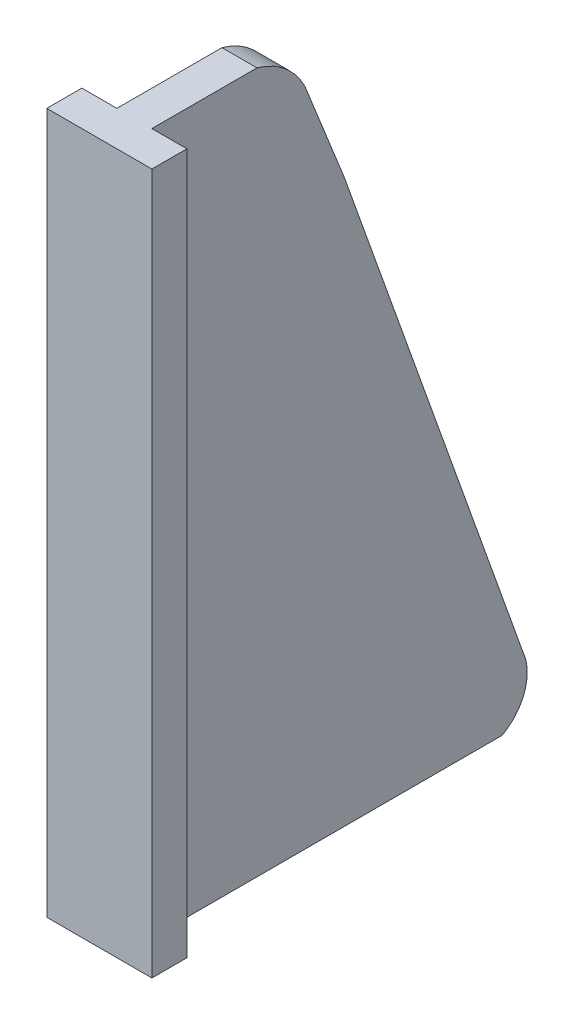
ISO-10303-21;
HEADER;
FILE_DESCRIPTION(('STEP AP214'),'2;1');
FILE_NAME('part.step','',(''),(''),'','','');
FILE_SCHEMA(('AUTOMOTIVE_DESIGN { 1 0 10303 214 1 1 1 1 }'));
ENDSEC;
DATA;
#1=APPLICATION_CONTEXT('core data for automotive mechanical design processes');
#2=APPLICATION_PROTOCOL_DEFINITION('international standard','automotive_design',2000,#1);
#3=PRODUCT_CONTEXT('',#1,'mechanical');
#4=PRODUCT('Part','Part','',(#3));
#5=PRODUCT_RELATED_PRODUCT_CATEGORY('part','',(#4));
#6=PRODUCT_DEFINITION_FORMATION('','',#4);
#7=PRODUCT_DEFINITION_CONTEXT('part definition',#1,'design');
#8=PRODUCT_DEFINITION('design','',#6,#7);
#9=PRODUCT_DEFINITION_SHAPE('','',#8);
#10=(LENGTH_UNIT() NAMED_UNIT(*) SI_UNIT(.MILLI.,.METRE.));
#11=(NAMED_UNIT(*) PLANE_ANGLE_UNIT() SI_UNIT($,.RADIAN.));
#12=(NAMED_UNIT(*) SI_UNIT($,.STERADIAN.) SOLID_ANGLE_UNIT());
#13=UNCERTAINTY_MEASURE_WITH_UNIT(LENGTH_MEASURE(1.E-05),#10,'distance_accuracy_value','');
#14=(GEOMETRIC_REPRESENTATION_CONTEXT(3) GLOBAL_UNCERTAINTY_ASSIGNED_CONTEXT((#13)) GLOBAL_UNIT_ASSIGNED_CONTEXT((#10,
#11,#12)) REPRESENTATION_CONTEXT('',''));
#15=CARTESIAN_POINT('',(0.,0.,0.));
#16=DIRECTION('',(0.,0.,1.));
#17=DIRECTION('',(1.,0.,0.));
#18=AXIS2_PLACEMENT_3D('',#15,#16,#17);
#19=CARTESIAN_POINT('',(30.,0.,0.));
#20=DIRECTION('',(0.,1.,0.));
#21=DIRECTION('',(0.,0.,1.));
#22=AXIS2_PLACEMENT_3D('',#19,#20,#21);
#23=PLANE('',#22);
#24=DIRECTION('',(-1.,0.,0.));
#25=VECTOR('',#24,1.);
#26=CARTESIAN_POINT('',(30.,0.,-10.));
#27=LINE('',#26,#25);
#28=CARTESIAN_POINT('',(10.,0.,-10.));
#29=VERTEX_POINT('',#28);
#30=CARTESIAN_POINT('',(0.,0.,-9.99999999999999));
#31=VERTEX_POINT('',#30);
#32=EDGE_CURVE('E47',#29,#31,#27,.T.);
#33=ORIENTED_EDGE('',*,*,#32,.F.);
#34=DIRECTION('',(0.,0.,-1.));
#35=VECTOR('',#34,1.);
#36=CARTESIAN_POINT('',(10.,0.,0.));
#37=LINE('',#36,#35);
#38=CARTESIAN_POINT('',(10.,0.,-110.));
#39=VERTEX_POINT('',#38);
#40=EDGE_CURVE('E117',#29,#39,#37,.T.);
#41=ORIENTED_EDGE('',*,*,#40,.T.);
#42=DIRECTION('',(-1.,0.,0.));
#43=VECTOR('',#42,1.);
#44=CARTESIAN_POINT('',(30.,0.,-110.));
#45=LINE('',#44,#43);
#46=CARTESIAN_POINT('',(20.,0.,-110.));
#47=VERTEX_POINT('',#46);
#48=EDGE_CURVE('E197',#47,#39,#45,.T.);
#49=ORIENTED_EDGE('',*,*,#48,.F.);
#50=DIRECTION('',(0.,0.,1.));
#51=VECTOR('',#50,1.);
#52=CARTESIAN_POINT('',(20.,0.,0.));
#53=LINE('',#52,#51);
#54=CARTESIAN_POINT('',(20.,0.,-10.));
#55=VERTEX_POINT('',#54);
#56=EDGE_CURVE('E165',#47,#55,#53,.T.);
#57=ORIENTED_EDGE('',*,*,#56,.T.);
#58=DIRECTION('',(-1.,0.,0.));
#59=VECTOR('',#58,1.);
#60=CARTESIAN_POINT('',(30.,0.,-10.));
#61=LINE('',#60,#59);
#62=CARTESIAN_POINT('',(30.,0.,-9.99999999999999));
#63=VERTEX_POINT('',#62);
#64=EDGE_CURVE('E151',#63,#55,#61,.T.);
#65=ORIENTED_EDGE('',*,*,#64,.F.);
#66=DIRECTION('',(0.,0.,-1.));
#67=VECTOR('',#66,1.);
#68=CARTESIAN_POINT('',(30.,0.,0.));
#69=LINE('',#68,#67);
#70=CARTESIAN_POINT('',(30.,0.,0.));
#71=VERTEX_POINT('',#70);
#72=EDGE_CURVE('E168',#71,#63,#69,.T.);
#73=ORIENTED_EDGE('',*,*,#72,.F.);
#74=DIRECTION('',(-1.,0.,0.));
#75=VECTOR('',#74,1.);
#76=CARTESIAN_POINT('',(30.,0.,0.));
#77=LINE('',#76,#75);
#78=CARTESIAN_POINT('',(0.,0.,0.));
#79=VERTEX_POINT('',#78);
#80=EDGE_CURVE('E176',#71,#79,#77,.T.);
#81=ORIENTED_EDGE('',*,*,#80,.T.);
#82=DIRECTION('',(0.,0.,-1.));
#83=VECTOR('',#82,1.);
#84=CARTESIAN_POINT('',(0.,0.,0.));
#85=LINE('',#84,#83);
#86=EDGE_CURVE('E136',#79,#31,#85,.T.);
#87=ORIENTED_EDGE('',*,*,#86,.T.);
#88=EDGE_LOOP('',(#33,#41,#49,#57,#65,#73,#81,#87));
#89=FACE_BOUND('',#88,.T.);
#90=ADVANCED_FACE('F33',(#89),#23,.F.);
#91=CARTESIAN_POINT('',(30.,200.,0.));
#92=DIRECTION('',(0.,-1.,0.));
#93=DIRECTION('',(0.,0.,-1.));
#94=AXIS2_PLACEMENT_3D('',#91,#92,#93);
#95=PLANE('',#94);
#96=DIRECTION('',(1.,0.,0.));
#97=VECTOR('',#96,1.);
#98=CARTESIAN_POINT('',(30.,200.,-9.99999999999999));
#99=LINE('',#98,#97);
#100=CARTESIAN_POINT('',(0.,200.,-9.99999999999999));
#101=VERTEX_POINT('',#100);
#102=CARTESIAN_POINT('',(10.,200.,-9.99999999999999));
#103=VERTEX_POINT('',#102);
#104=EDGE_CURVE('E131',#101,#103,#99,.T.);
#105=ORIENTED_EDGE('',*,*,#104,.F.);
#106=DIRECTION('',(0.,0.,1.));
#107=VECTOR('',#106,1.);
#108=CARTESIAN_POINT('',(0.,200.,0.));
#109=LINE('',#108,#107);
#110=CARTESIAN_POINT('',(0.,200.,0.));
#111=VERTEX_POINT('',#110);
#112=EDGE_CURVE('E178',#101,#111,#109,.T.);
#113=ORIENTED_EDGE('',*,*,#112,.T.);
#114=DIRECTION('',(-1.,0.,0.));
#115=VECTOR('',#114,1.);
#116=CARTESIAN_POINT('',(30.,200.,0.));
#117=LINE('',#116,#115);
#118=CARTESIAN_POINT('',(30.,200.,0.));
#119=VERTEX_POINT('',#118);
#120=EDGE_CURVE('E182',#119,#111,#117,.T.);
#121=ORIENTED_EDGE('',*,*,#120,.F.);
#122=DIRECTION('',(0.,0.,1.));
#123=VECTOR('',#122,1.);
#124=CARTESIAN_POINT('',(30.,200.,0.));
#125=LINE('',#124,#123);
#126=CARTESIAN_POINT('',(30.,200.,-9.99999999999999));
#127=VERTEX_POINT('',#126);
#128=EDGE_CURVE('E171',#127,#119,#125,.T.);
#129=ORIENTED_EDGE('',*,*,#128,.F.);
#130=DIRECTION('',(1.,0.,0.));
#131=VECTOR('',#130,1.);
#132=CARTESIAN_POINT('',(30.,200.,-10.));
#133=LINE('',#132,#131);
#134=CARTESIAN_POINT('',(20.,200.,-10.));
#135=VERTEX_POINT('',#134);
#136=EDGE_CURVE('E55',#135,#127,#133,.T.);
#137=ORIENTED_EDGE('',*,*,#136,.F.);
#138=DIRECTION('',(0.,0.,-1.));
#139=VECTOR('',#138,1.);
#140=CARTESIAN_POINT('',(20.,200.,0.));
#141=LINE('',#140,#139);
#142=CARTESIAN_POINT('',(20.,200.,-40.0204083587879));
#143=VERTEX_POINT('',#142);
#144=EDGE_CURVE('E201',#135,#143,#141,.T.);
#145=ORIENTED_EDGE('',*,*,#144,.T.);
#146=DIRECTION('',(-1.,0.,0.));
#147=VECTOR('',#146,1.);
#148=CARTESIAN_POINT('',(30.,200.,-40.0204083587879));
#149=LINE('',#148,#147);
#150=CARTESIAN_POINT('',(10.,200.,-40.0204083587879));
#151=VERTEX_POINT('',#150);
#152=EDGE_CURVE('E185',#143,#151,#149,.T.);
#153=ORIENTED_EDGE('',*,*,#152,.T.);
#154=DIRECTION('',(0.,0.,1.));
#155=VECTOR('',#154,1.);
#156=CARTESIAN_POINT('',(10.,200.,0.));
#157=LINE('',#156,#155);
#158=EDGE_CURVE('E127',#151,#103,#157,.T.);
#159=ORIENTED_EDGE('',*,*,#158,.T.);
#160=EDGE_LOOP('',(#105,#113,#121,#129,#137,#145,#153,#159));
#161=FACE_BOUND('',#160,.T.);
#162=ADVANCED_FACE('F208',(#161),#95,.F.);
#163=CARTESIAN_POINT('',(0.,12.,-103.499588137662));
#164=DIRECTION('',(-1.,0.,0.));
#165=DIRECTION('',(0.,0.,1.));
#166=AXIS2_PLACEMENT_3D('',#163,#164,#165);
#167=PLANE('',#166);
#168=ORIENTED_EDGE('',*,*,#112,.F.);
#169=DIRECTION('',(0.,-1.,0.));
#170=VECTOR('',#169,1.);
#171=CARTESIAN_POINT('',(0.,12.,-9.99999999999999));
#172=LINE('',#171,#170);
#173=EDGE_CURVE('E40',#101,#31,#172,.T.);
#174=ORIENTED_EDGE('',*,*,#173,.T.);
#175=ORIENTED_EDGE('',*,*,#86,.F.);
#176=DIRECTION('',(0.,-1.,0.));
#177=VECTOR('',#176,1.);
#178=CARTESIAN_POINT('',(0.,0.,0.));
#179=LINE('',#178,#177);
#180=EDGE_CURVE('E172',#111,#79,#179,.T.);
#181=ORIENTED_EDGE('',*,*,#180,.F.);
#182=EDGE_LOOP('',(#168,#174,#175,#181));
#183=FACE_BOUND('',#182,.T.);
#184=ADVANCED_FACE('F205',(#183),#167,.T.);
#185=CARTESIAN_POINT('',(30.,12.,-103.499588137662));
#186=DIRECTION('',(-1.,0.,0.));
#187=DIRECTION('',(0.,0.,1.));
#188=AXIS2_PLACEMENT_3D('',#185,#186,#187);
#189=PLANE('',#188);
#190=DIRECTION('',(0.,-1.,0.));
#191=VECTOR('',#190,1.);
#192=CARTESIAN_POINT('',(30.,12.,-9.99999999999999));
#193=LINE('',#192,#191);
#194=EDGE_CURVE('E199',#127,#63,#193,.T.);
#195=ORIENTED_EDGE('',*,*,#194,.F.);
#196=ORIENTED_EDGE('',*,*,#128,.T.);
#197=DIRECTION('',(0.,-1.,0.));
#198=VECTOR('',#197,1.);
#199=CARTESIAN_POINT('',(30.,0.,0.));
#200=LINE('',#199,#198);
#201=EDGE_CURVE('E174',#119,#71,#200,.T.);
#202=ORIENTED_EDGE('',*,*,#201,.T.);
#203=ORIENTED_EDGE('',*,*,#72,.T.);
#204=EDGE_LOOP('',(#195,#196,#202,#203));
#205=FACE_BOUND('',#204,.T.);
#206=ADVANCED_FACE('F230',(#205),#189,.F.);
#207=CARTESIAN_POINT('',(30.,12.,-103.499588137662));
#208=DIRECTION('',(-1.,0.,0.));
#209=DIRECTION('',(0.,0.,1.));
#210=AXIS2_PLACEMENT_3D('',#207,#208,#209);
#211=CYLINDRICAL_SURFACE('',#210,13.6475402318522);
#212=ORIENTED_EDGE('',*,*,#48,.T.);
#213=CARTESIAN_POINT('',(10.,12.,-103.499588137662));
#214=DIRECTION('',(1.,0.,0.));
#215=DIRECTION('',(0.,0.,-1.));
#216=AXIS2_PLACEMENT_3D('',#213,#214,#215);
#217=CIRCLE('',#216,13.6475402318522);
#218=CARTESIAN_POINT('',(10.,17.653015860956,-115.921293578374));
#219=VERTEX_POINT('',#218);
#220=EDGE_CURVE('E122',#39,#219,#217,.T.);
#221=ORIENTED_EDGE('',*,*,#220,.T.);
#222=DIRECTION('',(-1.,0.,0.));
#223=VECTOR('',#222,1.);
#224=CARTESIAN_POINT('',(30.,17.653015860956,-115.921293578374));
#225=LINE('',#224,#223);
#226=CARTESIAN_POINT('',(20.,17.653015860956,-115.921293578374));
#227=VERTEX_POINT('',#226);
#228=EDGE_CURVE('E194',#227,#219,#225,.T.);
#229=ORIENTED_EDGE('',*,*,#228,.F.);
#230=CARTESIAN_POINT('',(20.,12.,-103.499588137662));
#231=DIRECTION('',(-1.,0.,0.));
#232=DIRECTION('',(0.,0.,1.));
#233=AXIS2_PLACEMENT_3D('',#230,#231,#232);
#234=CIRCLE('',#233,13.6475402318522);
#235=EDGE_CURVE('E162',#227,#47,#234,.T.);
#236=ORIENTED_EDGE('',*,*,#235,.T.);
#237=EDGE_LOOP('',(#212,#221,#229,#236));
#238=FACE_BOUND('',#237,.T.);
#239=ADVANCED_FACE('F221',(#238),#211,.T.);
#240=CARTESIAN_POINT('',(30.,17.653015860956,-115.921293578374));
#241=DIRECTION('',(0.,-0.336282011289057,0.941761333291714));
#242=DIRECTION('',(0.,-0.941761333291714,-0.336282011289057));
#243=AXIS2_PLACEMENT_3D('',#240,#241,#242);
#244=PLANE('',#243);
#245=ORIENTED_EDGE('',*,*,#228,.T.);
#246=DIRECTION('',(0.,0.941761333291714,0.336282011289057));
#247=VECTOR('',#246,1.);
#248=CARTESIAN_POINT('',(10.,17.653015860956,-115.921293578374));
#249=LINE('',#248,#247);
#250=CARTESIAN_POINT('',(10.,160.769350552618,-64.8176358074485));
#251=VERTEX_POINT('',#250);
#252=EDGE_CURVE('E140',#219,#251,#249,.T.);
#253=ORIENTED_EDGE('',*,*,#252,.T.);
#254=DIRECTION('',(-1.,0.,0.));
#255=VECTOR('',#254,1.);
#256=CARTESIAN_POINT('',(30.,160.769350552618,-64.8176358074485));
#257=LINE('',#256,#255);
#258=CARTESIAN_POINT('',(20.,160.769350552618,-64.8176358074485));
#259=VERTEX_POINT('',#258);
#260=EDGE_CURVE('E191',#259,#251,#257,.T.);
#261=ORIENTED_EDGE('',*,*,#260,.F.);
#262=DIRECTION('',(0.,-0.941761333291714,-0.336282011289057));
#263=VECTOR('',#262,1.);
#264=CARTESIAN_POINT('',(20.,17.653015860956,-115.921293578374));
#265=LINE('',#264,#263);
#266=EDGE_CURVE('E159',#259,#227,#265,.T.);
#267=ORIENTED_EDGE('',*,*,#266,.T.);
#268=EDGE_LOOP('',(#245,#253,#261,#267));
#269=FACE_BOUND('',#268,.T.);
#270=ADVANCED_FACE('F218',(#269),#244,.F.);
#271=CARTESIAN_POINT('',(30.,160.769350552618,-64.8176358074485));
#272=DIRECTION('',(0.,-0.37158346663813,0.928399551551588));
#273=DIRECTION('',(0.,-0.928399551551588,-0.37158346663813));
#274=AXIS2_PLACEMENT_3D('',#271,#272,#273);
#275=PLANE('',#274);
#276=ORIENTED_EDGE('',*,*,#260,.T.);
#277=DIRECTION('',(0.,0.928399551551588,0.37158346663813));
#278=VECTOR('',#277,1.);
#279=CARTESIAN_POINT('',(10.,160.769350552618,-64.8176358074485));
#280=LINE('',#279,#278);
#281=CARTESIAN_POINT('',(10.,188.5,-53.7186958773678));
#282=VERTEX_POINT('',#281);
#283=EDGE_CURVE('E137',#251,#282,#280,.T.);
#284=ORIENTED_EDGE('',*,*,#283,.T.);
#285=DIRECTION('',(-1.,0.,0.));
#286=VECTOR('',#285,1.);
#287=CARTESIAN_POINT('',(30.,188.5,-53.7186958773678));
#288=LINE('',#287,#286);
#289=CARTESIAN_POINT('',(20.,188.5,-53.7186958773678));
#290=VERTEX_POINT('',#289);
#291=EDGE_CURVE('E188',#290,#282,#288,.T.);
#292=ORIENTED_EDGE('',*,*,#291,.F.);
#293=DIRECTION('',(0.,-0.928399551551588,-0.37158346663813));
#294=VECTOR('',#293,1.);
#295=CARTESIAN_POINT('',(20.,160.769350552618,-64.8176358074485));
#296=LINE('',#295,#294);
#297=EDGE_CURVE('E156',#290,#259,#296,.T.);
#298=ORIENTED_EDGE('',*,*,#297,.T.);
#299=EDGE_LOOP('',(#276,#284,#292,#298));
#300=FACE_BOUND('',#299,.T.);
#301=ADVANCED_FACE('F215',(#300),#275,.F.);
#302=CARTESIAN_POINT('',(30.,179.088676301627,-34.1413025252148));
#303=DIRECTION('',(-1.,0.,0.));
#304=DIRECTION('',(0.,0.,1.));
#305=AXIS2_PLACEMENT_3D('',#302,#303,#304);
#306=CYLINDRICAL_SURFACE('',#305,21.7220474223881);
#307=ORIENTED_EDGE('',*,*,#291,.T.);
#308=CARTESIAN_POINT('',(10.,179.088676301627,-34.1413025252148));
#309=DIRECTION('',(1.,0.,0.));
#310=DIRECTION('',(0.,0.,-1.));
#311=AXIS2_PLACEMENT_3D('',#308,#309,#310);
#312=CIRCLE('',#311,21.7220474223881);
#313=EDGE_CURVE('E11',#282,#151,#312,.T.);
#314=ORIENTED_EDGE('',*,*,#313,.T.);
#315=ORIENTED_EDGE('',*,*,#152,.F.);
#316=CARTESIAN_POINT('',(20.,179.088676301627,-34.1413025252148));
#317=DIRECTION('',(-1.,0.,0.));
#318=DIRECTION('',(0.,0.,1.));
#319=AXIS2_PLACEMENT_3D('',#316,#317,#318);
#320=CIRCLE('',#319,21.7220474223881);
#321=EDGE_CURVE('E153',#143,#290,#320,.T.);
#322=ORIENTED_EDGE('',*,*,#321,.T.);
#323=EDGE_LOOP('',(#307,#314,#315,#322));
#324=FACE_BOUND('',#323,.T.);
#325=ADVANCED_FACE('F212',(#324),#306,.T.);
#326=CARTESIAN_POINT('',(30.,0.,0.));
#327=DIRECTION('',(0.,0.,-1.));
#328=DIRECTION('',(-1.,0.,0.));
#329=AXIS2_PLACEMENT_3D('',#326,#327,#328);
#330=PLANE('',#329);
#331=ORIENTED_EDGE('',*,*,#180,.T.);
#332=ORIENTED_EDGE('',*,*,#80,.F.);
#333=ORIENTED_EDGE('',*,*,#201,.F.);
#334=ORIENTED_EDGE('',*,*,#120,.T.);
#335=EDGE_LOOP('',(#331,#332,#333,#334));
#336=FACE_BOUND('',#335,.T.);
#337=ADVANCED_FACE('F233',(#336),#330,.F.);
#338=CARTESIAN_POINT('',(20.,0.,0.));
#339=DIRECTION('',(-1.,0.,0.));
#340=DIRECTION('',(0.,0.,1.));
#341=AXIS2_PLACEMENT_3D('',#338,#339,#340);
#342=PLANE('',#341);
#343=ORIENTED_EDGE('',*,*,#235,.F.);
#344=ORIENTED_EDGE('',*,*,#266,.F.);
#345=ORIENTED_EDGE('',*,*,#297,.F.);
#346=ORIENTED_EDGE('',*,*,#321,.F.);
#347=ORIENTED_EDGE('',*,*,#144,.F.);
#348=DIRECTION('',(0.,-1.,0.));
#349=VECTOR('',#348,1.);
#350=CARTESIAN_POINT('',(20.,-0.765127075955848,-10.));
#351=LINE('',#350,#349);
#352=EDGE_CURVE('E126',#135,#55,#351,.T.);
#353=ORIENTED_EDGE('',*,*,#352,.T.);
#354=ORIENTED_EDGE('',*,*,#56,.F.);
#355=EDGE_LOOP('',(#343,#344,#345,#346,#347,#353,#354));
#356=FACE_BOUND('',#355,.T.);
#357=ADVANCED_FACE('F225',(#356),#342,.F.);
#358=CARTESIAN_POINT('',(46.,-0.765127075955848,-10.));
#359=DIRECTION('',(0.,0.,-1.));
#360=DIRECTION('',(-1.,0.,0.));
#361=AXIS2_PLACEMENT_3D('',#358,#359,#360);
#362=PLANE('',#361);
#363=ORIENTED_EDGE('',*,*,#64,.T.);
#364=ORIENTED_EDGE('',*,*,#352,.F.);
#365=ORIENTED_EDGE('',*,*,#136,.T.);
#366=ORIENTED_EDGE('',*,*,#194,.T.);
#367=EDGE_LOOP('',(#363,#364,#365,#366));
#368=FACE_BOUND('',#367,.T.);
#369=ADVANCED_FACE('F226',(#368),#362,.T.);
#370=CARTESIAN_POINT('',(10.,0.,0.));
#371=DIRECTION('',(1.,0.,0.));
#372=DIRECTION('',(0.,0.,-1.));
#373=AXIS2_PLACEMENT_3D('',#370,#371,#372);
#374=PLANE('',#373);
#375=DIRECTION('',(0.,1.,0.));
#376=VECTOR('',#375,1.);
#377=CARTESIAN_POINT('',(10.,-3.3125218578531,-10.));
#378=LINE('',#377,#376);
#379=EDGE_CURVE('E119',#29,#103,#378,.T.);
#380=ORIENTED_EDGE('',*,*,#379,.T.);
#381=ORIENTED_EDGE('',*,*,#158,.F.);
#382=ORIENTED_EDGE('',*,*,#313,.F.);
#383=ORIENTED_EDGE('',*,*,#283,.F.);
#384=ORIENTED_EDGE('',*,*,#252,.F.);
#385=ORIENTED_EDGE('',*,*,#220,.F.);
#386=ORIENTED_EDGE('',*,*,#40,.F.);
#387=EDGE_LOOP('',(#380,#381,#382,#383,#384,#385,#386));
#388=FACE_BOUND('',#387,.T.);
#389=ADVANCED_FACE('F118',(#388),#374,.F.);
#390=CARTESIAN_POINT('',(-62.,-3.3125218578531,-10.));
#391=DIRECTION('',(0.,0.,-1.));
#392=DIRECTION('',(0.,1.,0.));
#393=AXIS2_PLACEMENT_3D('',#390,#391,#392);
#394=PLANE('',#393);
#395=ORIENTED_EDGE('',*,*,#32,.T.);
#396=ORIENTED_EDGE('',*,*,#173,.F.);
#397=ORIENTED_EDGE('',*,*,#104,.T.);
#398=ORIENTED_EDGE('',*,*,#379,.F.);
#399=EDGE_LOOP('',(#395,#396,#397,#398));
#400=FACE_BOUND('',#399,.T.);
#401=ADVANCED_FACE('F129',(#400),#394,.T.);
#402=CLOSED_SHELL('',(#90,#162,#184,#206,#239,#270,#301,#325,#337,#357,#369,#389,#401));
#403=MANIFOLD_SOLID_BREP('B2',#402);
#404=ADVANCED_BREP_SHAPE_REPRESENTATION('',(#18,#403),#14);
#405=SHAPE_DEFINITION_REPRESENTATION(#9,#404);
ENDSEC;
END-ISO-10303-21;
